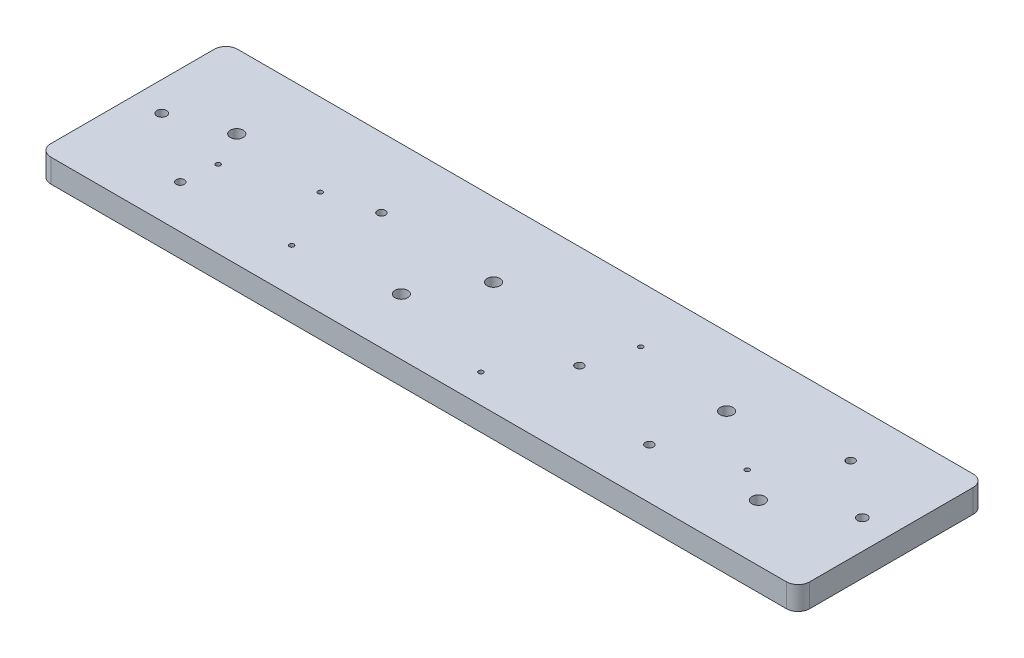
ISO-10303-21;
HEADER;
FILE_DESCRIPTION(('STEP AP214'),'2;1');
FILE_NAME('part.step','',(''),(''),'','','');
FILE_SCHEMA(('AUTOMOTIVE_DESIGN { 1 0 10303 214 1 1 1 1 }'));
ENDSEC;
DATA;
#1=APPLICATION_CONTEXT('core data for automotive mechanical design processes');
#2=APPLICATION_PROTOCOL_DEFINITION('international standard','automotive_design',2000,#1);
#3=PRODUCT_CONTEXT('',#1,'mechanical');
#4=PRODUCT('Part','Part','',(#3));
#5=PRODUCT_RELATED_PRODUCT_CATEGORY('part','',(#4));
#6=PRODUCT_DEFINITION_FORMATION('','',#4);
#7=PRODUCT_DEFINITION_CONTEXT('part definition',#1,'design');
#8=PRODUCT_DEFINITION('design','',#6,#7);
#9=PRODUCT_DEFINITION_SHAPE('','',#8);
#10=(LENGTH_UNIT() NAMED_UNIT(*) SI_UNIT(.MILLI.,.METRE.));
#11=(NAMED_UNIT(*) PLANE_ANGLE_UNIT() SI_UNIT($,.RADIAN.));
#12=(NAMED_UNIT(*) SI_UNIT($,.STERADIAN.) SOLID_ANGLE_UNIT());
#13=UNCERTAINTY_MEASURE_WITH_UNIT(LENGTH_MEASURE(1.E-05),#10,'distance_accuracy_value','');
#14=(GEOMETRIC_REPRESENTATION_CONTEXT(3) GLOBAL_UNCERTAINTY_ASSIGNED_CONTEXT((#13)) GLOBAL_UNIT_ASSIGNED_CONTEXT((#10,
#11,#12)) REPRESENTATION_CONTEXT('',''));
#15=CARTESIAN_POINT('',(0.,0.,0.));
#16=DIRECTION('',(0.,0.,1.));
#17=DIRECTION('',(1.,0.,0.));
#18=AXIS2_PLACEMENT_3D('',#15,#16,#17);
#19=CARTESIAN_POINT('',(0.,20.,0.));
#20=DIRECTION('',(-1.,0.,0.));
#21=DIRECTION('',(0.,0.,1.));
#22=AXIS2_PLACEMENT_3D('',#19,#20,#21);
#23=PLANE('',#22);
#24=DIRECTION('',(0.,0.,-1.));
#25=VECTOR('',#24,1.);
#26=CARTESIAN_POINT('',(0.,20.,0.));
#27=LINE('',#26,#25);
#28=CARTESIAN_POINT('',(0.,20.,-10.));
#29=VERTEX_POINT('',#28);
#30=CARTESIAN_POINT('',(0.,20.,-150.));
#31=VERTEX_POINT('',#30);
#32=EDGE_CURVE('E201',#29,#31,#27,.T.);
#33=ORIENTED_EDGE('',*,*,#32,.T.);
#34=DIRECTION('',(0.,-1.,0.));
#35=VECTOR('',#34,1.);
#36=CARTESIAN_POINT('',(0.,20.,-150.));
#37=LINE('',#36,#35);
#38=CARTESIAN_POINT('',(0.,0.,-150.));
#39=VERTEX_POINT('',#38);
#40=EDGE_CURVE('E137',#31,#39,#37,.T.);
#41=ORIENTED_EDGE('',*,*,#40,.T.);
#42=DIRECTION('',(0.,0.,-1.));
#43=VECTOR('',#42,1.);
#44=CARTESIAN_POINT('',(0.,0.,0.));
#45=LINE('',#44,#43);
#46=CARTESIAN_POINT('',(0.,0.,-10.));
#47=VERTEX_POINT('',#46);
#48=EDGE_CURVE('E120',#47,#39,#45,.T.);
#49=ORIENTED_EDGE('',*,*,#48,.F.);
#50=DIRECTION('',(0.,-1.,0.));
#51=VECTOR('',#50,1.);
#52=CARTESIAN_POINT('',(0.,20.,-10.));
#53=LINE('',#52,#51);
#54=EDGE_CURVE('E134',#47,#29,#53,.F.);
#55=ORIENTED_EDGE('',*,*,#54,.T.);
#56=EDGE_LOOP('',(#33,#41,#49,#55));
#57=FACE_BOUND('',#56,.T.);
#58=ADVANCED_FACE('F51',(#57),#23,.T.);
#59=CARTESIAN_POINT('',(0.,20.,0.));
#60=DIRECTION('',(0.,0.,-1.));
#61=DIRECTION('',(-1.,0.,0.));
#62=AXIS2_PLACEMENT_3D('',#59,#60,#61);
#63=PLANE('',#62);
#64=DIRECTION('',(1.,0.,0.));
#65=VECTOR('',#64,1.);
#66=CARTESIAN_POINT('',(0.,20.,0.));
#67=LINE('',#66,#65);
#68=CARTESIAN_POINT('',(10.,20.,0.));
#69=VERTEX_POINT('',#68);
#70=CARTESIAN_POINT('',(640.,20.,0.));
#71=VERTEX_POINT('',#70);
#72=EDGE_CURVE('E146',#69,#71,#67,.T.);
#73=ORIENTED_EDGE('',*,*,#72,.F.);
#74=DIRECTION('',(0.,-1.,0.));
#75=VECTOR('',#74,1.);
#76=CARTESIAN_POINT('',(10.,0.,0.));
#77=LINE('',#76,#75);
#78=CARTESIAN_POINT('',(10.,0.,0.));
#79=VERTEX_POINT('',#78);
#80=EDGE_CURVE('E184',#69,#79,#77,.T.);
#81=ORIENTED_EDGE('',*,*,#80,.T.);
#82=DIRECTION('',(1.,0.,0.));
#83=VECTOR('',#82,1.);
#84=CARTESIAN_POINT('',(0.,0.,0.));
#85=LINE('',#84,#83);
#86=CARTESIAN_POINT('',(640.,0.,0.));
#87=VERTEX_POINT('',#86);
#88=EDGE_CURVE('E122',#79,#87,#85,.T.);
#89=ORIENTED_EDGE('',*,*,#88,.T.);
#90=DIRECTION('',(0.,-1.,0.));
#91=VECTOR('',#90,1.);
#92=CARTESIAN_POINT('',(640.,20.,0.));
#93=LINE('',#92,#91);
#94=EDGE_CURVE('E181',#87,#71,#93,.F.);
#95=ORIENTED_EDGE('',*,*,#94,.T.);
#96=EDGE_LOOP('',(#73,#81,#89,#95));
#97=FACE_BOUND('',#96,.T.);
#98=ADVANCED_FACE('F413',(#97),#63,.F.);
#99=CARTESIAN_POINT('',(650.,20.,0.));
#100=DIRECTION('',(-1.,0.,0.));
#101=DIRECTION('',(0.,0.,1.));
#102=AXIS2_PLACEMENT_3D('',#99,#100,#101);
#103=PLANE('',#102);
#104=DIRECTION('',(0.,0.,-1.));
#105=VECTOR('',#104,1.);
#106=CARTESIAN_POINT('',(650.,0.,0.));
#107=LINE('',#106,#105);
#108=CARTESIAN_POINT('',(650.,0.,-10.));
#109=VERTEX_POINT('',#108);
#110=CARTESIAN_POINT('',(650.,0.,-150.));
#111=VERTEX_POINT('',#110);
#112=EDGE_CURVE('E194',#109,#111,#107,.T.);
#113=ORIENTED_EDGE('',*,*,#112,.T.);
#114=DIRECTION('',(0.,-1.,0.));
#115=VECTOR('',#114,1.);
#116=CARTESIAN_POINT('',(650.,20.,-150.));
#117=LINE('',#116,#115);
#118=CARTESIAN_POINT('',(650.,20.,-150.));
#119=VERTEX_POINT('',#118);
#120=EDGE_CURVE('E11',#111,#119,#117,.F.);
#121=ORIENTED_EDGE('',*,*,#120,.T.);
#122=DIRECTION('',(0.,0.,-1.));
#123=VECTOR('',#122,1.);
#124=CARTESIAN_POINT('',(650.,20.,0.));
#125=LINE('',#124,#123);
#126=CARTESIAN_POINT('',(650.,20.,-10.));
#127=VERTEX_POINT('',#126);
#128=EDGE_CURVE('E153',#127,#119,#125,.T.);
#129=ORIENTED_EDGE('',*,*,#128,.F.);
#130=DIRECTION('',(0.,-1.,0.));
#131=VECTOR('',#130,1.);
#132=CARTESIAN_POINT('',(650.,20.,-10.));
#133=LINE('',#132,#131);
#134=EDGE_CURVE('E60',#127,#109,#133,.T.);
#135=ORIENTED_EDGE('',*,*,#134,.T.);
#136=EDGE_LOOP('',(#113,#121,#129,#135));
#137=FACE_BOUND('',#136,.T.);
#138=ADVANCED_FACE('F193',(#137),#103,.F.);
#139=CARTESIAN_POINT('',(0.,20.,-160.));
#140=DIRECTION('',(0.,0.,-1.));
#141=DIRECTION('',(-1.,0.,0.));
#142=AXIS2_PLACEMENT_3D('',#139,#140,#141);
#143=PLANE('',#142);
#144=DIRECTION('',(1.,0.,0.));
#145=VECTOR('',#144,1.);
#146=CARTESIAN_POINT('',(0.,0.,-160.));
#147=LINE('',#146,#145);
#148=CARTESIAN_POINT('',(10.,0.,-160.));
#149=VERTEX_POINT('',#148);
#150=CARTESIAN_POINT('',(640.,0.,-160.));
#151=VERTEX_POINT('',#150);
#152=EDGE_CURVE('E139',#149,#151,#147,.T.);
#153=ORIENTED_EDGE('',*,*,#152,.F.);
#154=DIRECTION('',(0.,-1.,0.));
#155=VECTOR('',#154,1.);
#156=CARTESIAN_POINT('',(10.,20.,-160.));
#157=LINE('',#156,#155);
#158=CARTESIAN_POINT('',(10.,20.,-160.));
#159=VERTEX_POINT('',#158);
#160=EDGE_CURVE('E168',#149,#159,#157,.F.);
#161=ORIENTED_EDGE('',*,*,#160,.T.);
#162=DIRECTION('',(1.,0.,0.));
#163=VECTOR('',#162,1.);
#164=CARTESIAN_POINT('',(0.,20.,-160.));
#165=LINE('',#164,#163);
#166=CARTESIAN_POINT('',(640.,20.,-160.));
#167=VERTEX_POINT('',#166);
#168=EDGE_CURVE('E207',#159,#167,#165,.T.);
#169=ORIENTED_EDGE('',*,*,#168,.T.);
#170=DIRECTION('',(0.,-1.,0.));
#171=VECTOR('',#170,1.);
#172=CARTESIAN_POINT('',(640.,0.,-160.));
#173=LINE('',#172,#171);
#174=EDGE_CURVE('E164',#167,#151,#173,.T.);
#175=ORIENTED_EDGE('',*,*,#174,.T.);
#176=EDGE_LOOP('',(#153,#161,#169,#175));
#177=FACE_BOUND('',#176,.T.);
#178=ADVANCED_FACE('F360',(#177),#143,.T.);
#179=CARTESIAN_POINT('',(0.,20.,0.));
#180=DIRECTION('',(0.,-1.,0.));
#181=DIRECTION('',(0.,0.,-1.));
#182=AXIS2_PLACEMENT_3D('',#179,#180,#181);
#183=PLANE('',#182);
#184=CARTESIAN_POINT('',(25.,20.,-80.));
#185=DIRECTION('',(0.,1.,0.));
#186=DIRECTION('',(0.,0.,1.));
#187=AXIS2_PLACEMENT_3D('',#184,#185,#186);
#188=CIRCLE('',#187,4.2);
#189=CARTESIAN_POINT('',(25.,20.,-75.8));
#190=VERTEX_POINT('',#189);
#191=EDGE_CURVE('E349',#190,#190,#188,.T.);
#192=ORIENTED_EDGE('',*,*,#191,.F.);
#193=EDGE_LOOP('',(#192));
#194=FACE_BOUND('',#193,.T.);
#195=CARTESIAN_POINT('',(625.,20.,-80.));
#196=DIRECTION('',(0.,1.,0.));
#197=DIRECTION('',(0.,0.,1.));
#198=AXIS2_PLACEMENT_3D('',#195,#196,#197);
#199=CIRCLE('',#198,4.19999999999998);
#200=CARTESIAN_POINT('',(625.,20.,-75.8));
#201=VERTEX_POINT('',#200);
#202=EDGE_CURVE('E341',#201,#201,#199,.T.);
#203=ORIENTED_EDGE('',*,*,#202,.F.);
#204=EDGE_LOOP('',(#203));
#205=FACE_BOUND('',#204,.T.);
#206=CARTESIAN_POINT('',(178.587076189916,20.,-37.6529586931211));
#207=DIRECTION('',(0.,1.,0.));
#208=DIRECTION('',(0.,0.,1.));
#209=AXIS2_PLACEMENT_3D('',#206,#207,#208);
#210=CIRCLE('',#209,2.);
#211=CARTESIAN_POINT('',(178.587076189916,20.,-35.6529586931211));
#212=VERTEX_POINT('',#211);
#213=EDGE_CURVE('E333',#212,#212,#210,.T.);
#214=ORIENTED_EDGE('',*,*,#213,.F.);
#215=EDGE_LOOP('',(#214));
#216=FACE_BOUND('',#215,.T.);
#217=CARTESIAN_POINT('',(151.347462457807,20.,-89.4082247841275));
#218=DIRECTION('',(0.,1.,0.));
#219=DIRECTION('',(0.,0.,1.));
#220=AXIS2_PLACEMENT_3D('',#217,#218,#219);
#221=CIRCLE('',#220,2.);
#222=CARTESIAN_POINT('',(151.347462457807,20.,-87.4082247841275));
#223=VERTEX_POINT('',#222);
#224=EDGE_CURVE('E325',#223,#223,#221,.T.);
#225=ORIENTED_EDGE('',*,*,#224,.F.);
#226=EDGE_LOOP('',(#225));
#227=FACE_BOUND('',#226,.T.);
#228=CARTESIAN_POINT('',(353.601594418714,20.,-24.7141421703694));
#229=DIRECTION('',(0.,1.,0.));
#230=DIRECTION('',(0.,0.,1.));
#231=AXIS2_PLACEMENT_3D('',#228,#229,#230);
#232=CIRCLE('',#231,2.);
#233=CARTESIAN_POINT('',(353.601594418714,20.,-22.7141421703694));
#234=VERTEX_POINT('',#233);
#235=EDGE_CURVE('E317',#234,#234,#232,.T.);
#236=ORIENTED_EDGE('',*,*,#235,.F.);
#237=EDGE_LOOP('',(#236));
#238=FACE_BOUND('',#237,.T.);
#239=CARTESIAN_POINT('',(403.313889479812,20.,-111.880906113117));
#240=DIRECTION('',(0.,1.,0.));
#241=DIRECTION('',(0.,0.,1.));
#242=AXIS2_PLACEMENT_3D('',#239,#240,#241);
#243=CIRCLE('',#242,2.);
#244=CARTESIAN_POINT('',(403.313889479812,20.,-109.880906113117));
#245=VERTEX_POINT('',#244);
#246=EDGE_CURVE('E309',#245,#245,#243,.T.);
#247=ORIENTED_EDGE('',*,*,#246,.F.);
#248=EDGE_LOOP('',(#247));
#249=FACE_BOUND('',#248,.T.);
#250=CARTESIAN_POINT('',(540.192948483658,20.,-66.2545531118351));
#251=DIRECTION('',(0.,1.,0.));
#252=DIRECTION('',(0.,0.,1.));
#253=AXIS2_PLACEMENT_3D('',#250,#251,#252);
#254=CIRCLE('',#253,2.);
#255=CARTESIAN_POINT('',(540.192948483658,20.,-64.2545531118351));
#256=VERTEX_POINT('',#255);
#257=EDGE_CURVE('E301',#256,#256,#254,.T.);
#258=ORIENTED_EDGE('',*,*,#257,.F.);
#259=EDGE_LOOP('',(#258));
#260=FACE_BOUND('',#259,.T.);
#261=CARTESIAN_POINT('',(87.0078360424779,20.,-66.2545531118351));
#262=DIRECTION('',(0.,1.,0.));
#263=DIRECTION('',(0.,0.,1.));
#264=AXIS2_PLACEMENT_3D('',#261,#262,#263);
#265=CIRCLE('',#264,2.);
#266=CARTESIAN_POINT('',(87.0078360424779,20.,-64.2545531118351));
#267=VERTEX_POINT('',#266);
#268=EDGE_CURVE('E293',#267,#267,#265,.T.);
#269=ORIENTED_EDGE('',*,*,#268,.F.);
#270=EDGE_LOOP('',(#269));
#271=FACE_BOUND('',#270,.T.);
#272=CARTESIAN_POINT('',(192.887873399273,20.,-100.304070276971));
#273=DIRECTION('',(0.,1.,0.));
#274=DIRECTION('',(0.,0.,1.));
#275=AXIS2_PLACEMENT_3D('',#272,#273,#274);
#276=CIRCLE('',#275,3.5);
#277=CARTESIAN_POINT('',(192.887873399273,20.,-96.8040702769709));
#278=VERTEX_POINT('',#277);
#279=EDGE_CURVE('E285',#278,#278,#276,.T.);
#280=ORIENTED_EDGE('',*,*,#279,.F.);
#281=EDGE_LOOP('',(#280));
#282=FACE_BOUND('',#281,.T.);
#283=CARTESIAN_POINT('',(83.9294184708383,20.,-36.9719683498184));
#284=DIRECTION('',(0.,1.,0.));
#285=DIRECTION('',(0.,0.,1.));
#286=AXIS2_PLACEMENT_3D('',#283,#284,#285);
#287=CIRCLE('',#286,3.5);
#288=CARTESIAN_POINT('',(83.9294184708383,20.,-33.4719683498184));
#289=VERTEX_POINT('',#288);
#290=EDGE_CURVE('E278',#289,#289,#287,.T.);
#291=ORIENTED_EDGE('',*,*,#290,.F.);
#292=EDGE_LOOP('',(#291));
#293=FACE_BOUND('',#292,.T.);
#294=CARTESIAN_POINT('',(391.056063300363,20.,-71.7024758582569));
#295=DIRECTION('',(0.,1.,0.));
#296=DIRECTION('',(0.,0.,1.));
#297=AXIS2_PLACEMENT_3D('',#294,#295,#296);
#298=CIRCLE('',#297,3.5);
#299=CARTESIAN_POINT('',(391.056063300363,20.,-68.2024758582569));
#300=VERTEX_POINT('',#299);
#301=EDGE_CURVE('E270',#300,#300,#298,.T.);
#302=ORIENTED_EDGE('',*,*,#301,.F.);
#303=EDGE_LOOP('',(#302));
#304=FACE_BOUND('',#303,.T.);
#305=CARTESIAN_POINT('',(577.647417365308,20.,-117.328828859539));
#306=DIRECTION('',(0.,1.,0.));
#307=DIRECTION('',(0.,0.,1.));
#308=AXIS2_PLACEMENT_3D('',#305,#306,#307);
#309=CIRCLE('',#308,3.49999999999995);
#310=CARTESIAN_POINT('',(577.647417365308,20.,-113.828828859539));
#311=VERTEX_POINT('',#310);
#312=EDGE_CURVE('E262',#311,#311,#309,.T.);
#313=ORIENTED_EDGE('',*,*,#312,.F.);
#314=EDGE_LOOP('',(#313));
#315=FACE_BOUND('',#314,.T.);
#316=CARTESIAN_POINT('',(479.584807929716,20.,-43.1008814395428));
#317=DIRECTION('',(0.,1.,0.));
#318=DIRECTION('',(0.,0.,1.));
#319=AXIS2_PLACEMENT_3D('',#316,#317,#318);
#320=CIRCLE('',#319,3.5);
#321=CARTESIAN_POINT('',(479.584807929716,20.,-39.6008814395428));
#322=VERTEX_POINT('',#321);
#323=EDGE_CURVE('E255',#322,#322,#320,.T.);
#324=ORIENTED_EDGE('',*,*,#323,.F.);
#325=EDGE_LOOP('',(#324));
#326=FACE_BOUND('',#325,.T.);
#327=CARTESIAN_POINT('',(72.3525826346922,20.,-96.8991185604573));
#328=DIRECTION('',(0.,1.,0.));
#329=DIRECTION('',(0.,0.,1.));
#330=AXIS2_PLACEMENT_3D('',#327,#328,#329);
#331=CIRCLE('',#330,5.49999999999999);
#332=CARTESIAN_POINT('',(72.3525826346922,20.,-91.3991185604574));
#333=VERTEX_POINT('',#332);
#334=EDGE_CURVE('E247',#333,#333,#331,.T.);
#335=ORIENTED_EDGE('',*,*,#334,.F.);
#336=EDGE_LOOP('',(#335));
#337=FACE_BOUND('',#336,.T.);
#338=CARTESIAN_POINT('',(261.667898072847,20.,-48.5488041859645));
#339=DIRECTION('',(0.,1.,0.));
#340=DIRECTION('',(0.,0.,1.));
#341=AXIS2_PLACEMENT_3D('',#338,#339,#340);
#342=CIRCLE('',#341,5.50000000000001);
#343=CARTESIAN_POINT('',(261.667898072847,20.,-43.0488041859645));
#344=VERTEX_POINT('',#343);
#345=EDGE_CURVE('E239',#344,#344,#342,.T.);
#346=ORIENTED_EDGE('',*,*,#345,.F.);
#347=EDGE_LOOP('',(#346));
#348=FACE_BOUND('',#347,.T.);
#349=CARTESIAN_POINT('',(487.756692049349,20.,-100.985060620274));
#350=DIRECTION('',(0.,1.,0.));
#351=DIRECTION('',(0.,0.,1.));
#352=AXIS2_PLACEMENT_3D('',#349,#350,#351);
#353=CIRCLE('',#352,5.50000000000001);
#354=CARTESIAN_POINT('',(487.756692049349,20.,-95.4850606202737));
#355=VERTEX_POINT('',#354);
#356=EDGE_CURVE('E231',#355,#355,#353,.T.);
#357=ORIENTED_EDGE('',*,*,#356,.F.);
#358=EDGE_LOOP('',(#357));
#359=FACE_BOUND('',#358,.T.);
#360=CARTESIAN_POINT('',(567.432562215767,20.,-48.5488041859645));
#361=DIRECTION('',(0.,1.,0.));
#362=DIRECTION('',(0.,0.,1.));
#363=AXIS2_PLACEMENT_3D('',#360,#361,#362);
#364=CIRCLE('',#363,5.49999999999995);
#365=CARTESIAN_POINT('',(567.432562215767,20.,-43.0488041859646));
#366=VERTEX_POINT('',#365);
#367=EDGE_CURVE('E224',#366,#366,#364,.T.);
#368=ORIENTED_EDGE('',*,*,#367,.F.);
#369=EDGE_LOOP('',(#368));
#370=FACE_BOUND('',#369,.T.);
#371=CARTESIAN_POINT('',(292.31246352147,20.,-96.8991185604573));
#372=DIRECTION('',(0.,1.,0.));
#373=DIRECTION('',(0.,0.,1.));
#374=AXIS2_PLACEMENT_3D('',#371,#372,#373);
#375=CIRCLE('',#374,5.50000000000001);
#376=CARTESIAN_POINT('',(292.31246352147,20.,-91.3991185604573));
#377=VERTEX_POINT('',#376);
#378=EDGE_CURVE('E216',#377,#377,#375,.T.);
#379=ORIENTED_EDGE('',*,*,#378,.F.);
#380=EDGE_LOOP('',(#379));
#381=FACE_BOUND('',#380,.T.);
#382=ORIENTED_EDGE('',*,*,#168,.F.);
#383=CARTESIAN_POINT('',(10.,20.,-150.));
#384=DIRECTION('',(0.,-1.,0.));
#385=DIRECTION('',(0.,0.,-1.));
#386=AXIS2_PLACEMENT_3D('',#383,#384,#385);
#387=CIRCLE('',#386,10.);
#388=EDGE_CURVE('E178',#159,#31,#387,.F.);
#389=ORIENTED_EDGE('',*,*,#388,.T.);
#390=ORIENTED_EDGE('',*,*,#32,.F.);
#391=CARTESIAN_POINT('',(10.,20.,-10.));
#392=DIRECTION('',(0.,-1.,0.));
#393=DIRECTION('',(0.,0.,-1.));
#394=AXIS2_PLACEMENT_3D('',#391,#392,#393);
#395=CIRCLE('',#394,10.);
#396=EDGE_CURVE('E144',#29,#69,#395,.F.);
#397=ORIENTED_EDGE('',*,*,#396,.T.);
#398=ORIENTED_EDGE('',*,*,#72,.T.);
#399=CARTESIAN_POINT('',(640.,20.,-10.));
#400=DIRECTION('',(0.,-1.,0.));
#401=DIRECTION('',(0.,0.,-1.));
#402=AXIS2_PLACEMENT_3D('',#399,#400,#401);
#403=CIRCLE('',#402,10.);
#404=EDGE_CURVE('E72',#71,#127,#403,.F.);
#405=ORIENTED_EDGE('',*,*,#404,.T.);
#406=ORIENTED_EDGE('',*,*,#128,.T.);
#407=CARTESIAN_POINT('',(640.,20.,-150.));
#408=DIRECTION('',(0.,-1.,0.));
#409=DIRECTION('',(0.,0.,-1.));
#410=AXIS2_PLACEMENT_3D('',#407,#408,#409);
#411=CIRCLE('',#410,10.);
#412=EDGE_CURVE('E173',#119,#167,#411,.F.);
#413=ORIENTED_EDGE('',*,*,#412,.T.);
#414=EDGE_LOOP('',(#382,#389,#390,#397,#398,#405,#406,#413));
#415=FACE_BOUND('',#414,.T.);
#416=ADVANCED_FACE('F357',(#194,#205,#216,#227,#238,#249,#260,#271,#282,#293,#304,#315,#326,
#337,#348,#359,#370,#381,#415),#183,.F.);
#417=CARTESIAN_POINT('',(0.,0.,0.));
#418=DIRECTION('',(0.,-1.,0.));
#419=DIRECTION('',(0.,0.,-1.));
#420=AXIS2_PLACEMENT_3D('',#417,#418,#419);
#421=PLANE('',#420);
#422=CARTESIAN_POINT('',(25.,0.,-80.));
#423=DIRECTION('',(0.,1.,0.));
#424=DIRECTION('',(0.,0.,1.));
#425=AXIS2_PLACEMENT_3D('',#422,#423,#424);
#426=CIRCLE('',#425,4.2);
#427=CARTESIAN_POINT('',(25.,0.,-75.8));
#428=VERTEX_POINT('',#427);
#429=EDGE_CURVE('E345',#428,#428,#426,.T.);
#430=ORIENTED_EDGE('',*,*,#429,.T.);
#431=EDGE_LOOP('',(#430));
#432=FACE_BOUND('',#431,.T.);
#433=CARTESIAN_POINT('',(625.,0.,-80.));
#434=DIRECTION('',(0.,1.,0.));
#435=DIRECTION('',(0.,0.,1.));
#436=AXIS2_PLACEMENT_3D('',#433,#434,#435);
#437=CIRCLE('',#436,4.19999999999998);
#438=CARTESIAN_POINT('',(625.,0.,-75.8));
#439=VERTEX_POINT('',#438);
#440=EDGE_CURVE('E337',#439,#439,#437,.T.);
#441=ORIENTED_EDGE('',*,*,#440,.T.);
#442=EDGE_LOOP('',(#441));
#443=FACE_BOUND('',#442,.T.);
#444=CARTESIAN_POINT('',(178.587076189916,0.,-37.6529586931211));
#445=DIRECTION('',(0.,1.,0.));
#446=DIRECTION('',(0.,0.,1.));
#447=AXIS2_PLACEMENT_3D('',#444,#445,#446);
#448=CIRCLE('',#447,2.);
#449=CARTESIAN_POINT('',(178.587076189916,0.,-35.6529586931211));
#450=VERTEX_POINT('',#449);
#451=EDGE_CURVE('E329',#450,#450,#448,.T.);
#452=ORIENTED_EDGE('',*,*,#451,.T.);
#453=EDGE_LOOP('',(#452));
#454=FACE_BOUND('',#453,.T.);
#455=CARTESIAN_POINT('',(151.347462457807,0.,-89.4082247841275));
#456=DIRECTION('',(0.,1.,0.));
#457=DIRECTION('',(0.,0.,1.));
#458=AXIS2_PLACEMENT_3D('',#455,#456,#457);
#459=CIRCLE('',#458,2.);
#460=CARTESIAN_POINT('',(151.347462457807,0.,-87.4082247841275));
#461=VERTEX_POINT('',#460);
#462=EDGE_CURVE('E321',#461,#461,#459,.T.);
#463=ORIENTED_EDGE('',*,*,#462,.T.);
#464=EDGE_LOOP('',(#463));
#465=FACE_BOUND('',#464,.T.);
#466=CARTESIAN_POINT('',(353.601594418714,0.,-24.7141421703694));
#467=DIRECTION('',(0.,1.,0.));
#468=DIRECTION('',(0.,0.,1.));
#469=AXIS2_PLACEMENT_3D('',#466,#467,#468);
#470=CIRCLE('',#469,2.);
#471=CARTESIAN_POINT('',(353.601594418714,0.,-22.7141421703694));
#472=VERTEX_POINT('',#471);
#473=EDGE_CURVE('E313',#472,#472,#470,.T.);
#474=ORIENTED_EDGE('',*,*,#473,.T.);
#475=EDGE_LOOP('',(#474));
#476=FACE_BOUND('',#475,.T.);
#477=CARTESIAN_POINT('',(403.313889479812,0.,-111.880906113117));
#478=DIRECTION('',(0.,1.,0.));
#479=DIRECTION('',(0.,0.,1.));
#480=AXIS2_PLACEMENT_3D('',#477,#478,#479);
#481=CIRCLE('',#480,2.);
#482=CARTESIAN_POINT('',(403.313889479812,0.,-109.880906113117));
#483=VERTEX_POINT('',#482);
#484=EDGE_CURVE('E305',#483,#483,#481,.T.);
#485=ORIENTED_EDGE('',*,*,#484,.T.);
#486=EDGE_LOOP('',(#485));
#487=FACE_BOUND('',#486,.T.);
#488=CARTESIAN_POINT('',(540.192948483658,0.,-66.2545531118351));
#489=DIRECTION('',(0.,1.,0.));
#490=DIRECTION('',(0.,0.,1.));
#491=AXIS2_PLACEMENT_3D('',#488,#489,#490);
#492=CIRCLE('',#491,2.);
#493=CARTESIAN_POINT('',(540.192948483658,0.,-64.2545531118351));
#494=VERTEX_POINT('',#493);
#495=EDGE_CURVE('E297',#494,#494,#492,.T.);
#496=ORIENTED_EDGE('',*,*,#495,.T.);
#497=EDGE_LOOP('',(#496));
#498=FACE_BOUND('',#497,.T.);
#499=CARTESIAN_POINT('',(87.0078360424779,0.,-66.2545531118351));
#500=DIRECTION('',(0.,1.,0.));
#501=DIRECTION('',(0.,0.,1.));
#502=AXIS2_PLACEMENT_3D('',#499,#500,#501);
#503=CIRCLE('',#502,2.);
#504=CARTESIAN_POINT('',(87.0078360424779,0.,-64.2545531118351));
#505=VERTEX_POINT('',#504);
#506=EDGE_CURVE('E289',#505,#505,#503,.T.);
#507=ORIENTED_EDGE('',*,*,#506,.T.);
#508=EDGE_LOOP('',(#507));
#509=FACE_BOUND('',#508,.T.);
#510=CARTESIAN_POINT('',(192.887873399273,0.,-100.304070276971));
#511=DIRECTION('',(0.,1.,0.));
#512=DIRECTION('',(0.,0.,1.));
#513=AXIS2_PLACEMENT_3D('',#510,#511,#512);
#514=CIRCLE('',#513,3.5);
#515=CARTESIAN_POINT('',(192.887873399273,0.,-96.8040702769709));
#516=VERTEX_POINT('',#515);
#517=EDGE_CURVE('E282',#516,#516,#514,.T.);
#518=ORIENTED_EDGE('',*,*,#517,.T.);
#519=EDGE_LOOP('',(#518));
#520=FACE_BOUND('',#519,.T.);
#521=CARTESIAN_POINT('',(83.9294184708383,0.,-36.9719683498184));
#522=DIRECTION('',(0.,1.,0.));
#523=DIRECTION('',(0.,0.,1.));
#524=AXIS2_PLACEMENT_3D('',#521,#522,#523);
#525=CIRCLE('',#524,3.49999999999999);
#526=CARTESIAN_POINT('',(83.9294184708383,0.,-33.4719683498184));
#527=VERTEX_POINT('',#526);
#528=EDGE_CURVE('E274',#527,#527,#525,.T.);
#529=ORIENTED_EDGE('',*,*,#528,.T.);
#530=EDGE_LOOP('',(#529));
#531=FACE_BOUND('',#530,.T.);
#532=CARTESIAN_POINT('',(391.056063300363,0.,-71.7024758582569));
#533=DIRECTION('',(0.,1.,0.));
#534=DIRECTION('',(0.,0.,1.));
#535=AXIS2_PLACEMENT_3D('',#532,#533,#534);
#536=CIRCLE('',#535,3.5);
#537=CARTESIAN_POINT('',(391.056063300363,0.,-68.2024758582569));
#538=VERTEX_POINT('',#537);
#539=EDGE_CURVE('E266',#538,#538,#536,.T.);
#540=ORIENTED_EDGE('',*,*,#539,.T.);
#541=EDGE_LOOP('',(#540));
#542=FACE_BOUND('',#541,.T.);
#543=CARTESIAN_POINT('',(577.647417365308,0.,-117.328828859539));
#544=DIRECTION('',(0.,1.,0.));
#545=DIRECTION('',(0.,0.,1.));
#546=AXIS2_PLACEMENT_3D('',#543,#544,#545);
#547=CIRCLE('',#546,3.49999999999995);
#548=CARTESIAN_POINT('',(577.647417365308,0.,-113.828828859539));
#549=VERTEX_POINT('',#548);
#550=EDGE_CURVE('E259',#549,#549,#547,.T.);
#551=ORIENTED_EDGE('',*,*,#550,.T.);
#552=EDGE_LOOP('',(#551));
#553=FACE_BOUND('',#552,.T.);
#554=CARTESIAN_POINT('',(479.584807929716,0.,-43.1008814395428));
#555=DIRECTION('',(0.,1.,0.));
#556=DIRECTION('',(0.,0.,1.));
#557=AXIS2_PLACEMENT_3D('',#554,#555,#556);
#558=CIRCLE('',#557,3.5);
#559=CARTESIAN_POINT('',(479.584807929716,0.,-39.6008814395428));
#560=VERTEX_POINT('',#559);
#561=EDGE_CURVE('E251',#560,#560,#558,.T.);
#562=ORIENTED_EDGE('',*,*,#561,.T.);
#563=EDGE_LOOP('',(#562));
#564=FACE_BOUND('',#563,.T.);
#565=CARTESIAN_POINT('',(72.3525826346922,0.,-96.8991185604573));
#566=DIRECTION('',(0.,1.,0.));
#567=DIRECTION('',(0.,0.,1.));
#568=AXIS2_PLACEMENT_3D('',#565,#566,#567);
#569=CIRCLE('',#568,5.49999999999999);
#570=CARTESIAN_POINT('',(72.3525826346922,0.,-91.3991185604574));
#571=VERTEX_POINT('',#570);
#572=EDGE_CURVE('E243',#571,#571,#569,.T.);
#573=ORIENTED_EDGE('',*,*,#572,.T.);
#574=EDGE_LOOP('',(#573));
#575=FACE_BOUND('',#574,.T.);
#576=CARTESIAN_POINT('',(261.667898072847,0.,-48.5488041859645));
#577=DIRECTION('',(0.,1.,0.));
#578=DIRECTION('',(0.,0.,1.));
#579=AXIS2_PLACEMENT_3D('',#576,#577,#578);
#580=CIRCLE('',#579,5.50000000000001);
#581=CARTESIAN_POINT('',(261.667898072847,0.,-43.0488041859645));
#582=VERTEX_POINT('',#581);
#583=EDGE_CURVE('E235',#582,#582,#580,.T.);
#584=ORIENTED_EDGE('',*,*,#583,.T.);
#585=EDGE_LOOP('',(#584));
#586=FACE_BOUND('',#585,.T.);
#587=CARTESIAN_POINT('',(487.756692049349,0.,-100.985060620274));
#588=DIRECTION('',(0.,1.,0.));
#589=DIRECTION('',(0.,0.,1.));
#590=AXIS2_PLACEMENT_3D('',#587,#588,#589);
#591=CIRCLE('',#590,5.50000000000001);
#592=CARTESIAN_POINT('',(487.756692049349,0.,-95.4850606202737));
#593=VERTEX_POINT('',#592);
#594=EDGE_CURVE('E227',#593,#593,#591,.T.);
#595=ORIENTED_EDGE('',*,*,#594,.T.);
#596=EDGE_LOOP('',(#595));
#597=FACE_BOUND('',#596,.T.);
#598=CARTESIAN_POINT('',(567.432562215767,0.,-48.5488041859645));
#599=DIRECTION('',(0.,1.,0.));
#600=DIRECTION('',(0.,0.,1.));
#601=AXIS2_PLACEMENT_3D('',#598,#599,#600);
#602=CIRCLE('',#601,5.49999999999995);
#603=CARTESIAN_POINT('',(567.432562215767,0.,-43.0488041859646));
#604=VERTEX_POINT('',#603);
#605=EDGE_CURVE('E220',#604,#604,#602,.T.);
#606=ORIENTED_EDGE('',*,*,#605,.T.);
#607=EDGE_LOOP('',(#606));
#608=FACE_BOUND('',#607,.T.);
#609=CARTESIAN_POINT('',(292.31246352147,0.,-96.8991185604573));
#610=DIRECTION('',(0.,1.,0.));
#611=DIRECTION('',(0.,0.,1.));
#612=AXIS2_PLACEMENT_3D('',#609,#610,#611);
#613=CIRCLE('',#612,5.50000000000001);
#614=CARTESIAN_POINT('',(292.31246352147,0.,-91.3991185604573));
#615=VERTEX_POINT('',#614);
#616=EDGE_CURVE('E140',#615,#615,#613,.T.);
#617=ORIENTED_EDGE('',*,*,#616,.T.);
#618=EDGE_LOOP('',(#617));
#619=FACE_BOUND('',#618,.T.);
#620=ORIENTED_EDGE('',*,*,#48,.T.);
#621=CARTESIAN_POINT('',(10.,0.,-150.));
#622=DIRECTION('',(0.,-1.,0.));
#623=DIRECTION('',(0.,0.,-1.));
#624=AXIS2_PLACEMENT_3D('',#621,#622,#623);
#625=CIRCLE('',#624,10.);
#626=EDGE_CURVE('E128',#39,#149,#625,.T.);
#627=ORIENTED_EDGE('',*,*,#626,.T.);
#628=ORIENTED_EDGE('',*,*,#152,.T.);
#629=CARTESIAN_POINT('',(640.,0.,-150.));
#630=DIRECTION('',(0.,-1.,0.));
#631=DIRECTION('',(0.,0.,-1.));
#632=AXIS2_PLACEMENT_3D('',#629,#630,#631);
#633=CIRCLE('',#632,10.);
#634=EDGE_CURVE('E129',#151,#111,#633,.T.);
#635=ORIENTED_EDGE('',*,*,#634,.T.);
#636=ORIENTED_EDGE('',*,*,#112,.F.);
#637=CARTESIAN_POINT('',(640.,0.,-10.));
#638=DIRECTION('',(0.,-1.,0.));
#639=DIRECTION('',(0.,0.,-1.));
#640=AXIS2_PLACEMENT_3D('',#637,#638,#639);
#641=CIRCLE('',#640,10.);
#642=EDGE_CURVE('E150',#109,#87,#641,.T.);
#643=ORIENTED_EDGE('',*,*,#642,.T.);
#644=ORIENTED_EDGE('',*,*,#88,.F.);
#645=CARTESIAN_POINT('',(10.,0.,-10.));
#646=DIRECTION('',(0.,-1.,0.));
#647=DIRECTION('',(0.,0.,-1.));
#648=AXIS2_PLACEMENT_3D('',#645,#646,#647);
#649=CIRCLE('',#648,10.);
#650=EDGE_CURVE('E117',#79,#47,#649,.T.);
#651=ORIENTED_EDGE('',*,*,#650,.T.);
#652=EDGE_LOOP('',(#620,#627,#628,#635,#636,#643,#644,#651));
#653=FACE_BOUND('',#652,.T.);
#654=ADVANCED_FACE('F119',(#432,#443,#454,#465,#476,#487,#498,#509,#520,#531,#542,#553,#564,
#575,#586,#597,#608,#619,#653),#421,.T.);
#655=CARTESIAN_POINT('',(10.,20.,-150.));
#656=DIRECTION('',(0.,-1.,0.));
#657=DIRECTION('',(0.,0.,-1.));
#658=AXIS2_PLACEMENT_3D('',#655,#656,#657);
#659=CYLINDRICAL_SURFACE('',#658,10.);
#660=ORIENTED_EDGE('',*,*,#388,.F.);
#661=ORIENTED_EDGE('',*,*,#160,.F.);
#662=ORIENTED_EDGE('',*,*,#626,.F.);
#663=ORIENTED_EDGE('',*,*,#40,.F.);
#664=EDGE_LOOP('',(#660,#661,#662,#663));
#665=FACE_BOUND('',#664,.T.);
#666=ADVANCED_FACE('F402',(#665),#659,.T.);
#667=CARTESIAN_POINT('',(10.,20.,-10.));
#668=DIRECTION('',(0.,1.,0.));
#669=DIRECTION('',(0.,0.,1.));
#670=AXIS2_PLACEMENT_3D('',#667,#668,#669);
#671=CYLINDRICAL_SURFACE('',#670,10.);
#672=ORIENTED_EDGE('',*,*,#396,.F.);
#673=ORIENTED_EDGE('',*,*,#54,.F.);
#674=ORIENTED_EDGE('',*,*,#650,.F.);
#675=ORIENTED_EDGE('',*,*,#80,.F.);
#676=EDGE_LOOP('',(#672,#673,#674,#675));
#677=FACE_BOUND('',#676,.T.);
#678=ADVANCED_FACE('F143',(#677),#671,.T.);
#679=CARTESIAN_POINT('',(640.,20.,-150.));
#680=DIRECTION('',(0.,1.,0.));
#681=DIRECTION('',(0.,0.,1.));
#682=AXIS2_PLACEMENT_3D('',#679,#680,#681);
#683=CYLINDRICAL_SURFACE('',#682,10.);
#684=ORIENTED_EDGE('',*,*,#412,.F.);
#685=ORIENTED_EDGE('',*,*,#120,.F.);
#686=ORIENTED_EDGE('',*,*,#634,.F.);
#687=ORIENTED_EDGE('',*,*,#174,.F.);
#688=EDGE_LOOP('',(#684,#685,#686,#687));
#689=FACE_BOUND('',#688,.T.);
#690=ADVANCED_FACE('F405',(#689),#683,.T.);
#691=CARTESIAN_POINT('',(640.,20.,-10.));
#692=DIRECTION('',(0.,-1.,0.));
#693=DIRECTION('',(0.,0.,-1.));
#694=AXIS2_PLACEMENT_3D('',#691,#692,#693);
#695=CYLINDRICAL_SURFACE('',#694,10.);
#696=ORIENTED_EDGE('',*,*,#404,.F.);
#697=ORIENTED_EDGE('',*,*,#94,.F.);
#698=ORIENTED_EDGE('',*,*,#642,.F.);
#699=ORIENTED_EDGE('',*,*,#134,.F.);
#700=EDGE_LOOP('',(#696,#697,#698,#699));
#701=FACE_BOUND('',#700,.T.);
#702=ADVANCED_FACE('F53',(#701),#695,.T.);
#703=CARTESIAN_POINT('',(292.31246352147,20.,-96.8991185604573));
#704=DIRECTION('',(0.,1.,0.));
#705=DIRECTION('',(0.,0.,1.));
#706=AXIS2_PLACEMENT_3D('',#703,#704,#705);
#707=CYLINDRICAL_SURFACE('',#706,5.50000000000001);
#708=ORIENTED_EDGE('',*,*,#616,.F.);
#709=EDGE_LOOP('',(#708));
#710=FACE_BOUND('',#709,.T.);
#711=ORIENTED_EDGE('',*,*,#378,.T.);
#712=EDGE_LOOP('',(#711));
#713=FACE_BOUND('',#712,.T.);
#714=ADVANCED_FACE('F410',(#710,#713),#707,.F.);
#715=CARTESIAN_POINT('',(567.432562215767,20.,-48.5488041859645));
#716=DIRECTION('',(0.,1.,0.));
#717=DIRECTION('',(0.,0.,1.));
#718=AXIS2_PLACEMENT_3D('',#715,#716,#717);
#719=CYLINDRICAL_SURFACE('',#718,5.49999999999995);
#720=ORIENTED_EDGE('',*,*,#605,.F.);
#721=EDGE_LOOP('',(#720));
#722=FACE_BOUND('',#721,.T.);
#723=ORIENTED_EDGE('',*,*,#367,.T.);
#724=EDGE_LOOP('',(#723));
#725=FACE_BOUND('',#724,.T.);
#726=ADVANCED_FACE('F606',(#722,#725),#719,.F.);
#727=CARTESIAN_POINT('',(487.756692049349,20.,-100.985060620274));
#728=DIRECTION('',(0.,1.,0.));
#729=DIRECTION('',(0.,0.,1.));
#730=AXIS2_PLACEMENT_3D('',#727,#728,#729);
#731=CYLINDRICAL_SURFACE('',#730,5.50000000000001);
#732=ORIENTED_EDGE('',*,*,#594,.F.);
#733=EDGE_LOOP('',(#732));
#734=FACE_BOUND('',#733,.T.);
#735=ORIENTED_EDGE('',*,*,#356,.T.);
#736=EDGE_LOOP('',(#735));
#737=FACE_BOUND('',#736,.T.);
#738=ADVANCED_FACE('F596',(#734,#737),#731,.F.);
#739=CARTESIAN_POINT('',(261.667898072847,20.,-48.5488041859645));
#740=DIRECTION('',(0.,1.,0.));
#741=DIRECTION('',(0.,0.,1.));
#742=AXIS2_PLACEMENT_3D('',#739,#740,#741);
#743=CYLINDRICAL_SURFACE('',#742,5.50000000000001);
#744=ORIENTED_EDGE('',*,*,#583,.F.);
#745=EDGE_LOOP('',(#744));
#746=FACE_BOUND('',#745,.T.);
#747=ORIENTED_EDGE('',*,*,#345,.T.);
#748=EDGE_LOOP('',(#747));
#749=FACE_BOUND('',#748,.T.);
#750=ADVANCED_FACE('F586',(#746,#749),#743,.F.);
#751=CARTESIAN_POINT('',(72.3525826346922,20.,-96.8991185604573));
#752=DIRECTION('',(0.,1.,0.));
#753=DIRECTION('',(0.,0.,1.));
#754=AXIS2_PLACEMENT_3D('',#751,#752,#753);
#755=CYLINDRICAL_SURFACE('',#754,5.49999999999999);
#756=ORIENTED_EDGE('',*,*,#572,.F.);
#757=EDGE_LOOP('',(#756));
#758=FACE_BOUND('',#757,.T.);
#759=ORIENTED_EDGE('',*,*,#334,.T.);
#760=EDGE_LOOP('',(#759));
#761=FACE_BOUND('',#760,.T.);
#762=ADVANCED_FACE('F576',(#758,#761),#755,.F.);
#763=CARTESIAN_POINT('',(479.584807929716,20.,-43.1008814395428));
#764=DIRECTION('',(0.,1.,0.));
#765=DIRECTION('',(0.,0.,1.));
#766=AXIS2_PLACEMENT_3D('',#763,#764,#765);
#767=CYLINDRICAL_SURFACE('',#766,3.5);
#768=ORIENTED_EDGE('',*,*,#561,.F.);
#769=EDGE_LOOP('',(#768));
#770=FACE_BOUND('',#769,.T.);
#771=ORIENTED_EDGE('',*,*,#323,.T.);
#772=EDGE_LOOP('',(#771));
#773=FACE_BOUND('',#772,.T.);
#774=ADVANCED_FACE('F566',(#770,#773),#767,.F.);
#775=CARTESIAN_POINT('',(577.647417365308,20.,-117.328828859539));
#776=DIRECTION('',(0.,1.,0.));
#777=DIRECTION('',(0.,0.,1.));
#778=AXIS2_PLACEMENT_3D('',#775,#776,#777);
#779=CYLINDRICAL_SURFACE('',#778,3.49999999999995);
#780=ORIENTED_EDGE('',*,*,#550,.F.);
#781=EDGE_LOOP('',(#780));
#782=FACE_BOUND('',#781,.T.);
#783=ORIENTED_EDGE('',*,*,#312,.T.);
#784=EDGE_LOOP('',(#783));
#785=FACE_BOUND('',#784,.T.);
#786=ADVANCED_FACE('F556',(#782,#785),#779,.F.);
#787=CARTESIAN_POINT('',(391.056063300363,20.,-71.7024758582569));
#788=DIRECTION('',(0.,1.,0.));
#789=DIRECTION('',(0.,0.,1.));
#790=AXIS2_PLACEMENT_3D('',#787,#788,#789);
#791=CYLINDRICAL_SURFACE('',#790,3.5);
#792=ORIENTED_EDGE('',*,*,#539,.F.);
#793=EDGE_LOOP('',(#792));
#794=FACE_BOUND('',#793,.T.);
#795=ORIENTED_EDGE('',*,*,#301,.T.);
#796=EDGE_LOOP('',(#795));
#797=FACE_BOUND('',#796,.T.);
#798=ADVANCED_FACE('F546',(#794,#797),#791,.F.);
#799=CARTESIAN_POINT('',(83.9294184708383,20.,-36.9719683498184));
#800=DIRECTION('',(0.,1.,0.));
#801=DIRECTION('',(0.,0.,1.));
#802=AXIS2_PLACEMENT_3D('',#799,#800,#801);
#803=CYLINDRICAL_SURFACE('',#802,3.5);
#804=ORIENTED_EDGE('',*,*,#528,.F.);
#805=EDGE_LOOP('',(#804));
#806=FACE_BOUND('',#805,.T.);
#807=ORIENTED_EDGE('',*,*,#290,.T.);
#808=EDGE_LOOP('',(#807));
#809=FACE_BOUND('',#808,.T.);
#810=ADVANCED_FACE('F536',(#806,#809),#803,.F.);
#811=CARTESIAN_POINT('',(192.887873399273,20.,-100.304070276971));
#812=DIRECTION('',(0.,1.,0.));
#813=DIRECTION('',(0.,0.,1.));
#814=AXIS2_PLACEMENT_3D('',#811,#812,#813);
#815=CYLINDRICAL_SURFACE('',#814,3.5);
#816=ORIENTED_EDGE('',*,*,#517,.F.);
#817=EDGE_LOOP('',(#816));
#818=FACE_BOUND('',#817,.T.);
#819=ORIENTED_EDGE('',*,*,#279,.T.);
#820=EDGE_LOOP('',(#819));
#821=FACE_BOUND('',#820,.T.);
#822=ADVANCED_FACE('F526',(#818,#821),#815,.F.);
#823=CARTESIAN_POINT('',(87.0078360424779,20.,-66.2545531118351));
#824=DIRECTION('',(0.,1.,0.));
#825=DIRECTION('',(0.,0.,1.));
#826=AXIS2_PLACEMENT_3D('',#823,#824,#825);
#827=CYLINDRICAL_SURFACE('',#826,2.);
#828=ORIENTED_EDGE('',*,*,#506,.F.);
#829=EDGE_LOOP('',(#828));
#830=FACE_BOUND('',#829,.T.);
#831=ORIENTED_EDGE('',*,*,#268,.T.);
#832=EDGE_LOOP('',(#831));
#833=FACE_BOUND('',#832,.T.);
#834=ADVANCED_FACE('F516',(#830,#833),#827,.F.);
#835=CARTESIAN_POINT('',(540.192948483658,20.,-66.2545531118351));
#836=DIRECTION('',(0.,1.,0.));
#837=DIRECTION('',(0.,0.,1.));
#838=AXIS2_PLACEMENT_3D('',#835,#836,#837);
#839=CYLINDRICAL_SURFACE('',#838,2.);
#840=ORIENTED_EDGE('',*,*,#495,.F.);
#841=EDGE_LOOP('',(#840));
#842=FACE_BOUND('',#841,.T.);
#843=ORIENTED_EDGE('',*,*,#257,.T.);
#844=EDGE_LOOP('',(#843));
#845=FACE_BOUND('',#844,.T.);
#846=ADVANCED_FACE('F506',(#842,#845),#839,.F.);
#847=CARTESIAN_POINT('',(403.313889479812,20.,-111.880906113117));
#848=DIRECTION('',(0.,1.,0.));
#849=DIRECTION('',(0.,0.,1.));
#850=AXIS2_PLACEMENT_3D('',#847,#848,#849);
#851=CYLINDRICAL_SURFACE('',#850,2.);
#852=ORIENTED_EDGE('',*,*,#484,.F.);
#853=EDGE_LOOP('',(#852));
#854=FACE_BOUND('',#853,.T.);
#855=ORIENTED_EDGE('',*,*,#246,.T.);
#856=EDGE_LOOP('',(#855));
#857=FACE_BOUND('',#856,.T.);
#858=ADVANCED_FACE('F496',(#854,#857),#851,.F.);
#859=CARTESIAN_POINT('',(353.601594418714,20.,-24.7141421703694));
#860=DIRECTION('',(0.,1.,0.));
#861=DIRECTION('',(0.,0.,1.));
#862=AXIS2_PLACEMENT_3D('',#859,#860,#861);
#863=CYLINDRICAL_SURFACE('',#862,2.);
#864=ORIENTED_EDGE('',*,*,#473,.F.);
#865=EDGE_LOOP('',(#864));
#866=FACE_BOUND('',#865,.T.);
#867=ORIENTED_EDGE('',*,*,#235,.T.);
#868=EDGE_LOOP('',(#867));
#869=FACE_BOUND('',#868,.T.);
#870=ADVANCED_FACE('F487',(#866,#869),#863,.F.);
#871=CARTESIAN_POINT('',(151.347462457807,20.,-89.4082247841275));
#872=DIRECTION('',(0.,1.,0.));
#873=DIRECTION('',(0.,0.,1.));
#874=AXIS2_PLACEMENT_3D('',#871,#872,#873);
#875=CYLINDRICAL_SURFACE('',#874,2.);
#876=ORIENTED_EDGE('',*,*,#462,.F.);
#877=EDGE_LOOP('',(#876));
#878=FACE_BOUND('',#877,.T.);
#879=ORIENTED_EDGE('',*,*,#224,.T.);
#880=EDGE_LOOP('',(#879));
#881=FACE_BOUND('',#880,.T.);
#882=ADVANCED_FACE('F478',(#878,#881),#875,.F.);
#883=CARTESIAN_POINT('',(178.587076189916,20.,-37.6529586931211));
#884=DIRECTION('',(0.,1.,0.));
#885=DIRECTION('',(0.,0.,1.));
#886=AXIS2_PLACEMENT_3D('',#883,#884,#885);
#887=CYLINDRICAL_SURFACE('',#886,2.);
#888=ORIENTED_EDGE('',*,*,#451,.F.);
#889=EDGE_LOOP('',(#888));
#890=FACE_BOUND('',#889,.T.);
#891=ORIENTED_EDGE('',*,*,#213,.T.);
#892=EDGE_LOOP('',(#891));
#893=FACE_BOUND('',#892,.T.);
#894=ADVANCED_FACE('F444',(#890,#893),#887,.F.);
#895=CARTESIAN_POINT('',(625.,20.,-80.));
#896=DIRECTION('',(0.,1.,0.));
#897=DIRECTION('',(0.,0.,1.));
#898=AXIS2_PLACEMENT_3D('',#895,#896,#897);
#899=CYLINDRICAL_SURFACE('',#898,4.19999999999998);
#900=ORIENTED_EDGE('',*,*,#440,.F.);
#901=EDGE_LOOP('',(#900));
#902=FACE_BOUND('',#901,.T.);
#903=ORIENTED_EDGE('',*,*,#202,.T.);
#904=EDGE_LOOP('',(#903));
#905=FACE_BOUND('',#904,.T.);
#906=ADVANCED_FACE('F455',(#902,#905),#899,.F.);
#907=CARTESIAN_POINT('',(25.,20.,-80.));
#908=DIRECTION('',(0.,1.,0.));
#909=DIRECTION('',(0.,0.,1.));
#910=AXIS2_PLACEMENT_3D('',#907,#908,#909);
#911=CYLINDRICAL_SURFACE('',#910,4.2);
#912=ORIENTED_EDGE('',*,*,#429,.F.);
#913=EDGE_LOOP('',(#912));
#914=FACE_BOUND('',#913,.T.);
#915=ORIENTED_EDGE('',*,*,#191,.T.);
#916=EDGE_LOOP('',(#915));
#917=FACE_BOUND('',#916,.T.);
#918=ADVANCED_FACE('F355',(#914,#917),#911,.F.);
#919=CLOSED_SHELL('',(#58,#98,#138,#178,#416,#654,#666,#678,#690,#702,#714,#726,#738,#750,#762,
#774,#786,#798,#810,#822,#834,#846,#858,#870,#882,#894,#906,#918));
#920=MANIFOLD_SOLID_BREP('B2',#919);
#921=ADVANCED_BREP_SHAPE_REPRESENTATION('',(#18,#920),#14);
#922=SHAPE_DEFINITION_REPRESENTATION(#9,#921);
ENDSEC;
END-ISO-10303-21;
